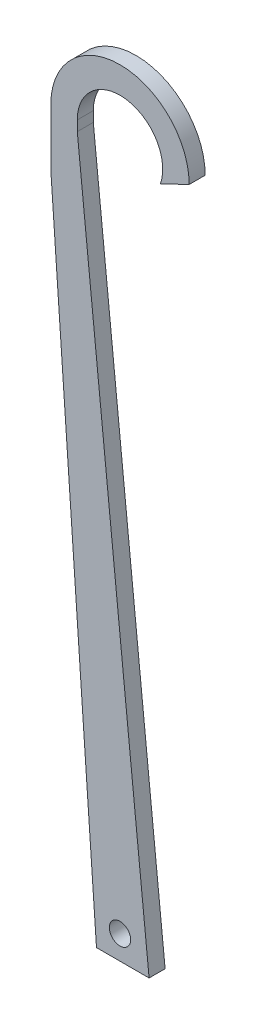
ISO-10303-21;
HEADER;
FILE_DESCRIPTION(('STEP AP214'),'2;1');
FILE_NAME('part.step','',(''),(''),'','','');
FILE_SCHEMA(('AUTOMOTIVE_DESIGN { 1 0 10303 214 1 1 1 1 }'));
ENDSEC;
DATA;
#1=APPLICATION_CONTEXT('core data for automotive mechanical design processes');
#2=APPLICATION_PROTOCOL_DEFINITION('international standard','automotive_design',2000,#1);
#3=PRODUCT_CONTEXT('',#1,'mechanical');
#4=PRODUCT('Part','Part','',(#3));
#5=PRODUCT_RELATED_PRODUCT_CATEGORY('part','',(#4));
#6=PRODUCT_DEFINITION_FORMATION('','',#4);
#7=PRODUCT_DEFINITION_CONTEXT('part definition',#1,'design');
#8=PRODUCT_DEFINITION('design','',#6,#7);
#9=PRODUCT_DEFINITION_SHAPE('','',#8);
#10=(LENGTH_UNIT() NAMED_UNIT(*) SI_UNIT(.MILLI.,.METRE.));
#11=(NAMED_UNIT(*) PLANE_ANGLE_UNIT() SI_UNIT($,.RADIAN.));
#12=(NAMED_UNIT(*) SI_UNIT($,.STERADIAN.) SOLID_ANGLE_UNIT());
#13=UNCERTAINTY_MEASURE_WITH_UNIT(LENGTH_MEASURE(1.E-05),#10,'distance_accuracy_value','');
#14=(GEOMETRIC_REPRESENTATION_CONTEXT(3) GLOBAL_UNCERTAINTY_ASSIGNED_CONTEXT((#13)) GLOBAL_UNIT_ASSIGNED_CONTEXT((#10,
#11,#12)) REPRESENTATION_CONTEXT('',''));
#15=CARTESIAN_POINT('',(0.,0.,0.));
#16=DIRECTION('',(0.,0.,1.));
#17=DIRECTION('',(1.,0.,0.));
#18=AXIS2_PLACEMENT_3D('',#15,#16,#17);
#19=CARTESIAN_POINT('',(0.,0.,9.525));
#20=DIRECTION('',(0.,0.,-1.));
#21=DIRECTION('',(-1.,0.,0.));
#22=AXIS2_PLACEMENT_3D('',#19,#20,#21);
#23=PLANE('',#22);
#24=CARTESIAN_POINT('',(0.,0.,9.525));
#25=DIRECTION('',(0.,0.,-1.));
#26=DIRECTION('',(-1.,0.,0.));
#27=AXIS2_PLACEMENT_3D('',#24,#25,#26);
#28=CIRCLE('',#27,25.4);
#29=CARTESIAN_POINT('',(-25.4,0.,9.525));
#30=VERTEX_POINT('',#29);
#31=CARTESIAN_POINT('',(24.0316271146219,-8.22440868535653,9.525));
#32=VERTEX_POINT('',#31);
#33=EDGE_CURVE('E92',#30,#32,#28,.T.);
#34=ORIENTED_EDGE('',*,*,#33,.T.);
#35=DIRECTION('',(0.901309996543014,0.433174664692699,0.));
#36=VECTOR('',#35,1.);
#37=CARTESIAN_POINT('',(24.0316271146219,-8.22440868535653,9.525));
#38=LINE('',#37,#36);
#39=CARTESIAN_POINT('',(41.1442201814989,0.,9.525));
#40=VERTEX_POINT('',#39);
#41=EDGE_CURVE('E177',#32,#40,#38,.T.);
#42=ORIENTED_EDGE('',*,*,#41,.T.);
#43=CARTESIAN_POINT('',(0.,0.,9.525));
#44=DIRECTION('',(0.,0.,1.));
#45=DIRECTION('',(1.,0.,0.));
#46=AXIS2_PLACEMENT_3D('',#43,#44,#45);
#47=CIRCLE('',#46,41.1442201814989);
#48=CARTESIAN_POINT('',(-41.1442201814989,0.,9.525));
#49=VERTEX_POINT('',#48);
#50=EDGE_CURVE('E160',#40,#49,#47,.T.);
#51=ORIENTED_EDGE('',*,*,#50,.T.);
#52=DIRECTION('',(0.,-1.,0.));
#53=VECTOR('',#52,1.);
#54=CARTESIAN_POINT('',(-41.1442201814989,0.,9.525));
#55=LINE('',#54,#53);
#56=CARTESIAN_POINT('',(-41.1442201814989,-33.7315346766842,9.525));
#57=VERTEX_POINT('',#56);
#58=EDGE_CURVE('E173',#49,#57,#55,.T.);
#59=ORIENTED_EDGE('',*,*,#58,.T.);
#60=DIRECTION('',(0.0700542564494104,-0.997543182600794,0.));
#61=VECTOR('',#60,1.);
#62=CARTESIAN_POINT('',(-41.1442201814989,-33.7315346766842,9.525));
#63=LINE('',#62,#61);
#64=CARTESIAN_POINT('',(-13.9770372855362,-420.580806396625,9.525));
#65=VERTEX_POINT('',#64);
#66=EDGE_CURVE('E112',#57,#65,#63,.T.);
#67=ORIENTED_EDGE('',*,*,#66,.T.);
#68=DIRECTION('',(1.,0.,0.));
#69=VECTOR('',#68,1.);
#70=CARTESIAN_POINT('',(-13.9770372855362,-420.580806396625,9.525));
#71=LINE('',#70,#69);
#72=CARTESIAN_POINT('',(17.3105846043317,-420.580806396625,9.525));
#73=VERTEX_POINT('',#72);
#74=EDGE_CURVE('E106',#65,#73,#71,.T.);
#75=ORIENTED_EDGE('',*,*,#74,.T.);
#76=DIRECTION('',(-0.102491693719621,0.994733860245284,0.));
#77=VECTOR('',#76,1.);
#78=CARTESIAN_POINT('',(17.3105846043317,-420.580806396625,9.525));
#79=LINE('',#78,#77);
#80=CARTESIAN_POINT('',(-25.4,-6.05292462481444,9.525));
#81=VERTEX_POINT('',#80);
#82=EDGE_CURVE('E110',#73,#81,#79,.T.);
#83=ORIENTED_EDGE('',*,*,#82,.T.);
#84=DIRECTION('',(0.,1.,0.));
#85=VECTOR('',#84,1.);
#86=CARTESIAN_POINT('',(-25.4,0.,9.525));
#87=LINE('',#86,#85);
#88=EDGE_CURVE('E50',#81,#30,#87,.T.);
#89=ORIENTED_EDGE('',*,*,#88,.T.);
#90=EDGE_LOOP('',(#34,#42,#51,#59,#67,#75,#83,#89));
#91=FACE_BOUND('',#90,.T.);
#92=CARTESIAN_POINT('',(0.,-406.4,9.525));
#93=DIRECTION('',(0.,0.,1.));
#94=DIRECTION('',(1.,0.,0.));
#95=AXIS2_PLACEMENT_3D('',#92,#93,#94);
#96=CIRCLE('',#95,6.35);
#97=CARTESIAN_POINT('',(-6.34999999999995,-406.4,9.525));
#98=VERTEX_POINT('',#97);
#99=EDGE_CURVE('E132',#98,#98,#96,.T.);
#100=ORIENTED_EDGE('',*,*,#99,.F.);
#101=EDGE_LOOP('',(#100));
#102=FACE_BOUND('',#101,.T.);
#103=ADVANCED_FACE('F33',(#91,#102),#23,.F.);
#104=CARTESIAN_POINT('',(0.,0.,0.));
#105=DIRECTION('',(0.,0.,-1.));
#106=DIRECTION('',(-1.,0.,0.));
#107=AXIS2_PLACEMENT_3D('',#104,#105,#106);
#108=PLANE('',#107);
#109=CARTESIAN_POINT('',(0.,0.,0.));
#110=DIRECTION('',(0.,0.,-1.));
#111=DIRECTION('',(-1.,0.,0.));
#112=AXIS2_PLACEMENT_3D('',#109,#110,#111);
#113=CIRCLE('',#112,25.4);
#114=CARTESIAN_POINT('',(-25.4,0.,0.));
#115=VERTEX_POINT('',#114);
#116=CARTESIAN_POINT('',(24.0316271146219,-8.22440868535653,0.));
#117=VERTEX_POINT('',#116);
#118=EDGE_CURVE('E86',#115,#117,#113,.T.);
#119=ORIENTED_EDGE('',*,*,#118,.F.);
#120=DIRECTION('',(0.,1.,0.));
#121=VECTOR('',#120,1.);
#122=CARTESIAN_POINT('',(-25.4,0.,0.));
#123=LINE('',#122,#121);
#124=CARTESIAN_POINT('',(-25.4,-6.05292462481444,0.));
#125=VERTEX_POINT('',#124);
#126=EDGE_CURVE('E142',#125,#115,#123,.T.);
#127=ORIENTED_EDGE('',*,*,#126,.F.);
#128=DIRECTION('',(-0.102491693719621,0.994733860245284,0.));
#129=VECTOR('',#128,1.);
#130=CARTESIAN_POINT('',(17.3105846043317,-420.580806396625,0.));
#131=LINE('',#130,#129);
#132=CARTESIAN_POINT('',(17.3105846043317,-420.580806396625,0.));
#133=VERTEX_POINT('',#132);
#134=EDGE_CURVE('E79',#133,#125,#131,.T.);
#135=ORIENTED_EDGE('',*,*,#134,.F.);
#136=DIRECTION('',(1.,0.,0.));
#137=VECTOR('',#136,1.);
#138=CARTESIAN_POINT('',(-13.9770372855362,-420.580806396625,0.));
#139=LINE('',#138,#137);
#140=CARTESIAN_POINT('',(-13.9770372855362,-420.580806396625,0.));
#141=VERTEX_POINT('',#140);
#142=EDGE_CURVE('E120',#141,#133,#139,.T.);
#143=ORIENTED_EDGE('',*,*,#142,.F.);
#144=DIRECTION('',(0.0700542564494104,-0.997543182600794,0.));
#145=VECTOR('',#144,1.);
#146=CARTESIAN_POINT('',(-41.1442201814989,-33.7315346766842,0.));
#147=LINE('',#146,#145);
#148=CARTESIAN_POINT('',(-41.1442201814989,-33.7315346766842,0.));
#149=VERTEX_POINT('',#148);
#150=EDGE_CURVE('E138',#149,#141,#147,.T.);
#151=ORIENTED_EDGE('',*,*,#150,.F.);
#152=DIRECTION('',(0.,-1.,0.));
#153=VECTOR('',#152,1.);
#154=CARTESIAN_POINT('',(-41.1442201814989,0.,0.));
#155=LINE('',#154,#153);
#156=CARTESIAN_POINT('',(-41.1442201814989,0.,0.));
#157=VERTEX_POINT('',#156);
#158=EDGE_CURVE('E136',#157,#149,#155,.T.);
#159=ORIENTED_EDGE('',*,*,#158,.F.);
#160=CARTESIAN_POINT('',(0.,0.,0.));
#161=DIRECTION('',(0.,0.,1.));
#162=DIRECTION('',(1.,0.,0.));
#163=AXIS2_PLACEMENT_3D('',#160,#161,#162);
#164=CIRCLE('',#163,41.1442201814989);
#165=CARTESIAN_POINT('',(41.1442201814989,0.,0.));
#166=VERTEX_POINT('',#165);
#167=EDGE_CURVE('E134',#166,#157,#164,.T.);
#168=ORIENTED_EDGE('',*,*,#167,.F.);
#169=DIRECTION('',(0.901309996543014,0.433174664692699,0.));
#170=VECTOR('',#169,1.);
#171=CARTESIAN_POINT('',(24.0316271146219,-8.22440868535653,0.));
#172=LINE('',#171,#170);
#173=EDGE_CURVE('E131',#117,#166,#172,.T.);
#174=ORIENTED_EDGE('',*,*,#173,.F.);
#175=EDGE_LOOP('',(#119,#127,#135,#143,#151,#159,#168,#174));
#176=FACE_BOUND('',#175,.T.);
#177=CARTESIAN_POINT('',(0.,-406.4,0.));
#178=DIRECTION('',(0.,0.,1.));
#179=DIRECTION('',(1.,0.,0.));
#180=AXIS2_PLACEMENT_3D('',#177,#178,#179);
#181=CIRCLE('',#180,6.35);
#182=CARTESIAN_POINT('',(-6.34999999999995,-406.4,0.));
#183=VERTEX_POINT('',#182);
#184=EDGE_CURVE('E180',#183,#183,#181,.T.);
#185=ORIENTED_EDGE('',*,*,#184,.T.);
#186=EDGE_LOOP('',(#185));
#187=FACE_BOUND('',#186,.T.);
#188=ADVANCED_FACE('F164',(#176,#187),#108,.T.);
#189=CARTESIAN_POINT('',(0.,0.,9.525));
#190=DIRECTION('',(0.,0.,-1.));
#191=DIRECTION('',(-1.,0.,0.));
#192=AXIS2_PLACEMENT_3D('',#189,#190,#191);
#193=CYLINDRICAL_SURFACE('',#192,25.4);
#194=ORIENTED_EDGE('',*,*,#118,.T.);
#195=DIRECTION('',(0.,0.,-1.));
#196=VECTOR('',#195,1.);
#197=CARTESIAN_POINT('',(24.0316271146219,-8.22440868535653,9.525));
#198=LINE('',#197,#196);
#199=EDGE_CURVE('E11',#32,#117,#198,.T.);
#200=ORIENTED_EDGE('',*,*,#199,.F.);
#201=ORIENTED_EDGE('',*,*,#33,.F.);
#202=DIRECTION('',(0.,0.,-1.));
#203=VECTOR('',#202,1.);
#204=CARTESIAN_POINT('',(-25.4,0.,9.525));
#205=LINE('',#204,#203);
#206=EDGE_CURVE('E126',#30,#115,#205,.T.);
#207=ORIENTED_EDGE('',*,*,#206,.T.);
#208=EDGE_LOOP('',(#194,#200,#201,#207));
#209=FACE_BOUND('',#208,.T.);
#210=ADVANCED_FACE('F35',(#209),#193,.F.);
#211=CARTESIAN_POINT('',(24.0316271146219,-8.22440868535653,9.525));
#212=DIRECTION('',(-0.433174664692699,0.901309996543014,0.));
#213=DIRECTION('',(-0.901309996543014,-0.433174664692699,0.));
#214=AXIS2_PLACEMENT_3D('',#211,#212,#213);
#215=PLANE('',#214);
#216=ORIENTED_EDGE('',*,*,#173,.T.);
#217=DIRECTION('',(0.,0.,-1.));
#218=VECTOR('',#217,1.);
#219=CARTESIAN_POINT('',(41.1442201814989,0.,9.525));
#220=LINE('',#219,#218);
#221=EDGE_CURVE('E42',#40,#166,#220,.T.);
#222=ORIENTED_EDGE('',*,*,#221,.F.);
#223=ORIENTED_EDGE('',*,*,#41,.F.);
#224=ORIENTED_EDGE('',*,*,#199,.T.);
#225=EDGE_LOOP('',(#216,#222,#223,#224));
#226=FACE_BOUND('',#225,.T.);
#227=ADVANCED_FACE('F209',(#226),#215,.F.);
#228=CARTESIAN_POINT('',(0.,0.,9.525));
#229=DIRECTION('',(0.,0.,-1.));
#230=DIRECTION('',(-1.,0.,0.));
#231=AXIS2_PLACEMENT_3D('',#228,#229,#230);
#232=CYLINDRICAL_SURFACE('',#231,41.1442201814989);
#233=ORIENTED_EDGE('',*,*,#167,.T.);
#234=DIRECTION('',(0.,0.,-1.));
#235=VECTOR('',#234,1.);
#236=CARTESIAN_POINT('',(-41.1442201814989,0.,9.525));
#237=LINE('',#236,#235);
#238=EDGE_CURVE('E151',#49,#157,#237,.T.);
#239=ORIENTED_EDGE('',*,*,#238,.F.);
#240=ORIENTED_EDGE('',*,*,#50,.F.);
#241=ORIENTED_EDGE('',*,*,#221,.T.);
#242=EDGE_LOOP('',(#233,#239,#240,#241));
#243=FACE_BOUND('',#242,.T.);
#244=ADVANCED_FACE('F158',(#243),#232,.T.);
#245=CARTESIAN_POINT('',(-41.1442201814989,0.,9.525));
#246=DIRECTION('',(1.,0.,0.));
#247=DIRECTION('',(0.,0.,-1.));
#248=AXIS2_PLACEMENT_3D('',#245,#246,#247);
#249=PLANE('',#248);
#250=ORIENTED_EDGE('',*,*,#158,.T.);
#251=DIRECTION('',(0.,0.,-1.));
#252=VECTOR('',#251,1.);
#253=CARTESIAN_POINT('',(-41.1442201814989,-33.7315346766842,9.525));
#254=LINE('',#253,#252);
#255=EDGE_CURVE('E148',#57,#149,#254,.T.);
#256=ORIENTED_EDGE('',*,*,#255,.F.);
#257=ORIENTED_EDGE('',*,*,#58,.F.);
#258=ORIENTED_EDGE('',*,*,#238,.T.);
#259=EDGE_LOOP('',(#250,#256,#257,#258));
#260=FACE_BOUND('',#259,.T.);
#261=ADVANCED_FACE('F169',(#260),#249,.F.);
#262=CARTESIAN_POINT('',(-41.1442201814989,-33.7315346766842,9.525));
#263=DIRECTION('',(0.997543182600794,0.0700542564494104,0.));
#264=DIRECTION('',(-0.0700542564494104,0.997543182600794,0.));
#265=AXIS2_PLACEMENT_3D('',#262,#263,#264);
#266=PLANE('',#265);
#267=ORIENTED_EDGE('',*,*,#150,.T.);
#268=DIRECTION('',(0.,0.,-1.));
#269=VECTOR('',#268,1.);
#270=CARTESIAN_POINT('',(-13.9770372855362,-420.580806396625,9.525));
#271=LINE('',#270,#269);
#272=EDGE_CURVE('E121',#65,#141,#271,.T.);
#273=ORIENTED_EDGE('',*,*,#272,.F.);
#274=ORIENTED_EDGE('',*,*,#66,.F.);
#275=ORIENTED_EDGE('',*,*,#255,.T.);
#276=EDGE_LOOP('',(#267,#273,#274,#275));
#277=FACE_BOUND('',#276,.T.);
#278=ADVANCED_FACE('F172',(#277),#266,.F.);
#279=CARTESIAN_POINT('',(-13.9770372855362,-420.580806396625,9.525));
#280=DIRECTION('',(0.,1.,0.));
#281=DIRECTION('',(0.,0.,1.));
#282=AXIS2_PLACEMENT_3D('',#279,#280,#281);
#283=PLANE('',#282);
#284=ORIENTED_EDGE('',*,*,#142,.T.);
#285=DIRECTION('',(0.,0.,-1.));
#286=VECTOR('',#285,1.);
#287=CARTESIAN_POINT('',(17.3105846043317,-420.580806396625,9.525));
#288=LINE('',#287,#286);
#289=EDGE_CURVE('E117',#73,#133,#288,.T.);
#290=ORIENTED_EDGE('',*,*,#289,.F.);
#291=ORIENTED_EDGE('',*,*,#74,.F.);
#292=ORIENTED_EDGE('',*,*,#272,.T.);
#293=EDGE_LOOP('',(#284,#290,#291,#292));
#294=FACE_BOUND('',#293,.T.);
#295=ADVANCED_FACE('F118',(#294),#283,.F.);
#296=CARTESIAN_POINT('',(17.3105846043317,-420.580806396625,9.525));
#297=DIRECTION('',(-0.994733860245284,-0.102491693719621,0.));
#298=DIRECTION('',(0.102491693719621,-0.994733860245284,0.));
#299=AXIS2_PLACEMENT_3D('',#296,#297,#298);
#300=PLANE('',#299);
#301=ORIENTED_EDGE('',*,*,#134,.T.);
#302=DIRECTION('',(0.,0.,-1.));
#303=VECTOR('',#302,1.);
#304=CARTESIAN_POINT('',(-25.4,-6.05292462481444,9.525));
#305=LINE('',#304,#303);
#306=EDGE_CURVE('E122',#81,#125,#305,.T.);
#307=ORIENTED_EDGE('',*,*,#306,.F.);
#308=ORIENTED_EDGE('',*,*,#82,.F.);
#309=ORIENTED_EDGE('',*,*,#289,.T.);
#310=EDGE_LOOP('',(#301,#307,#308,#309));
#311=FACE_BOUND('',#310,.T.);
#312=ADVANCED_FACE('F124',(#311),#300,.F.);
#313=CARTESIAN_POINT('',(-25.4,0.,9.525));
#314=DIRECTION('',(-1.,0.,0.));
#315=DIRECTION('',(0.,0.,1.));
#316=AXIS2_PLACEMENT_3D('',#313,#314,#315);
#317=PLANE('',#316);
#318=ORIENTED_EDGE('',*,*,#126,.T.);
#319=ORIENTED_EDGE('',*,*,#206,.F.);
#320=ORIENTED_EDGE('',*,*,#88,.F.);
#321=ORIENTED_EDGE('',*,*,#306,.T.);
#322=EDGE_LOOP('',(#318,#319,#320,#321));
#323=FACE_BOUND('',#322,.T.);
#324=ADVANCED_FACE('F196',(#323),#317,.F.);
#325=CARTESIAN_POINT('',(0.,-406.4,9.525));
#326=DIRECTION('',(0.,0.,-1.));
#327=DIRECTION('',(-1.,0.,0.));
#328=AXIS2_PLACEMENT_3D('',#325,#326,#327);
#329=CYLINDRICAL_SURFACE('',#328,6.35);
#330=CARTESIAN_POINT('',(-6.34999999999995,-406.4,9.525));
#331=CARTESIAN_POINT('',(-6.34999999999995,-406.4,9.42578125));
#332=CARTESIAN_POINT('',(-6.34999999999995,-406.4,9.3265625));
#333=CARTESIAN_POINT('',(-6.34999999999995,-406.4,9.128125));
#334=CARTESIAN_POINT('',(-6.34999999999995,-406.4,9.02890625));
#335=CARTESIAN_POINT('',(-6.34999999999995,-406.4,8.83046875));
#336=CARTESIAN_POINT('',(-6.34999999999995,-406.4,8.73125));
#337=CARTESIAN_POINT('',(-6.34999999999995,-406.4,8.5328125));
#338=CARTESIAN_POINT('',(-6.34999999999995,-406.4,8.43359375));
#339=CARTESIAN_POINT('',(-6.34999999999995,-406.4,8.23515625));
#340=CARTESIAN_POINT('',(-6.34999999999995,-406.4,8.1359375));
#341=CARTESIAN_POINT('',(-6.34999999999995,-406.4,7.9375));
#342=CARTESIAN_POINT('',(-6.34999999999995,-406.4,7.83828125));
#343=CARTESIAN_POINT('',(-6.34999999999995,-406.4,7.63984375));
#344=CARTESIAN_POINT('',(-6.34999999999995,-406.4,7.540625));
#345=CARTESIAN_POINT('',(-6.34999999999995,-406.4,7.3421875));
#346=CARTESIAN_POINT('',(-6.34999999999995,-406.4,7.24296875));
#347=CARTESIAN_POINT('',(-6.34999999999995,-406.4,7.04453125));
#348=CARTESIAN_POINT('',(-6.34999999999995,-406.4,6.9453125));
#349=CARTESIAN_POINT('',(-6.34999999999995,-406.4,6.746875));
#350=CARTESIAN_POINT('',(-6.34999999999995,-406.4,6.64765625));
#351=CARTESIAN_POINT('',(-6.34999999999995,-406.4,6.44921875));
#352=CARTESIAN_POINT('',(-6.34999999999995,-406.4,6.35));
#353=CARTESIAN_POINT('',(-6.34999999999995,-406.4,6.1515625));
#354=CARTESIAN_POINT('',(-6.34999999999995,-406.4,6.05234375));
#355=CARTESIAN_POINT('',(-6.34999999999995,-406.4,5.85390625));
#356=CARTESIAN_POINT('',(-6.34999999999995,-406.4,5.7546875));
#357=CARTESIAN_POINT('',(-6.34999999999995,-406.4,5.55625));
#358=CARTESIAN_POINT('',(-6.34999999999995,-406.4,5.45703125));
#359=CARTESIAN_POINT('',(-6.34999999999995,-406.4,5.25859375));
#360=CARTESIAN_POINT('',(-6.34999999999995,-406.4,5.159375));
#361=CARTESIAN_POINT('',(-6.34999999999995,-406.4,4.9609375));
#362=CARTESIAN_POINT('',(-6.34999999999995,-406.4,4.86171875));
#363=CARTESIAN_POINT('',(-6.34999999999995,-406.4,4.66328125));
#364=CARTESIAN_POINT('',(-6.34999999999995,-406.4,4.5640625));
#365=CARTESIAN_POINT('',(-6.34999999999995,-406.4,4.365625));
#366=CARTESIAN_POINT('',(-6.34999999999995,-406.4,4.26640625));
#367=CARTESIAN_POINT('',(-6.34999999999995,-406.4,4.06796875));
#368=CARTESIAN_POINT('',(-6.34999999999995,-406.4,3.96875));
#369=CARTESIAN_POINT('',(-6.34999999999995,-406.4,3.7703125));
#370=CARTESIAN_POINT('',(-6.34999999999995,-406.4,3.67109375));
#371=CARTESIAN_POINT('',(-6.34999999999995,-406.4,3.47265625));
#372=CARTESIAN_POINT('',(-6.34999999999995,-406.4,3.3734375));
#373=CARTESIAN_POINT('',(-6.34999999999995,-406.4,3.175));
#374=CARTESIAN_POINT('',(-6.34999999999995,-406.4,3.07578125));
#375=CARTESIAN_POINT('',(-6.34999999999995,-406.4,2.87734375));
#376=CARTESIAN_POINT('',(-6.34999999999995,-406.4,2.778125));
#377=CARTESIAN_POINT('',(-6.34999999999995,-406.4,2.5796875));
#378=CARTESIAN_POINT('',(-6.34999999999995,-406.4,2.48046875));
#379=CARTESIAN_POINT('',(-6.34999999999995,-406.4,2.28203125));
#380=CARTESIAN_POINT('',(-6.34999999999995,-406.4,2.1828125));
#381=CARTESIAN_POINT('',(-6.34999999999995,-406.4,1.984375));
#382=CARTESIAN_POINT('',(-6.34999999999995,-406.4,1.88515625));
#383=CARTESIAN_POINT('',(-6.34999999999995,-406.4,1.68671875));
#384=CARTESIAN_POINT('',(-6.34999999999995,-406.4,1.5875));
#385=CARTESIAN_POINT('',(-6.34999999999995,-406.4,1.3890625));
#386=CARTESIAN_POINT('',(-6.34999999999995,-406.4,1.28984375));
#387=CARTESIAN_POINT('',(-6.34999999999995,-406.4,1.09140625));
#388=CARTESIAN_POINT('',(-6.34999999999995,-406.4,0.992187500000001));
#389=CARTESIAN_POINT('',(-6.34999999999995,-406.4,0.793750000000001));
#390=CARTESIAN_POINT('',(-6.34999999999995,-406.4,0.69453125));
#391=CARTESIAN_POINT('',(-6.34999999999995,-406.4,0.49609375));
#392=CARTESIAN_POINT('',(-6.34999999999995,-406.4,0.396875));
#393=CARTESIAN_POINT('',(-6.34999999999995,-406.4,0.1984375));
#394=CARTESIAN_POINT('',(-6.34999999999995,-406.4,0.0992187500000001));
#395=CARTESIAN_POINT('',(-6.34999999999995,-406.4,0.));
#396=B_SPLINE_CURVE_WITH_KNOTS('',3,(#330,#331,#332,#333,#334,#335,#336,#337,#338,#339,#340,
#341,#342,#343,#344,#345,#346,#347,#348,#349,#350,#351,#352,#353,#354,#355,#356,#357,#358,#359,
#360,#361,#362,#363,#364,#365,#366,#367,#368,#369,#370,#371,#372,#373,#374,#375,#376,#377,#378,
#379,#380,#381,#382,#383,#384,#385,#386,#387,#388,#389,#390,#391,#392,#393,#394,#395),
.UNSPECIFIED.,.F.,.F.,(4,2,2,2,2,2,2,2,2,2,2,2,2,2,2,2,2,2,2,2,2,2,2,2,2,2,2,2,2,2,2,2,4),(0.,
0.297656249999998,0.595312499999999,0.892968749999999,1.190625,1.48828125,1.7859375,2.08359375,
2.38125,2.67890625,2.9765625,3.27421875,3.571875,3.86953125,4.1671875,4.46484375,4.7625,
5.06015625,5.3578125,5.65546875,5.953125,6.25078125,6.5484375,6.84609375,7.14375,7.44140625,
7.7390625,8.03671875,8.334375,8.63203125,8.9296875,9.22734375,9.525),.UNSPECIFIED.);
#397=EDGE_CURVE('BSEAM186',#98,#183,#396,.T.);
#398=ORIENTED_EDGE('',*,*,#99,.T.);
#399=ORIENTED_EDGE('',*,*,#184,.F.);
#400=ORIENTED_EDGE('',*,*,#397,.T.);
#401=ORIENTED_EDGE('',*,*,#397,.F.);
#402=EDGE_LOOP('',(#398,#400,#399,#401));
#403=FACE_BOUND('',#402,.T.);
#404=ADVANCED_FACE('F186',(#403),#329,.F.);
#405=CLOSED_SHELL('',(#103,#188,#210,#227,#244,#261,#278,#295,#312,#324,#404));
#406=MANIFOLD_SOLID_BREP('B2',#405);
#407=ADVANCED_BREP_SHAPE_REPRESENTATION('',(#18,#406),#14);
#408=SHAPE_DEFINITION_REPRESENTATION(#9,#407);
ENDSEC;
END-ISO-10303-21;
